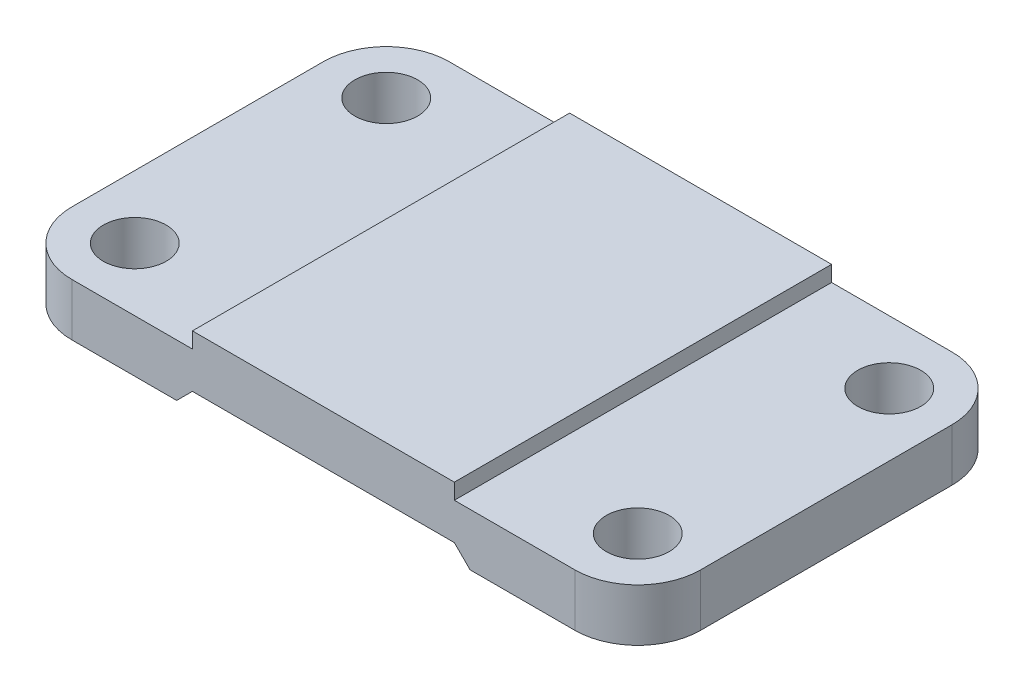
ISO-10303-21;
HEADER;
FILE_DESCRIPTION(('STEP AP214'),'2;1');
FILE_NAME('part.step','',(''),(''),'','','');
FILE_SCHEMA(('AUTOMOTIVE_DESIGN { 1 0 10303 214 1 1 1 1 }'));
ENDSEC;
DATA;
#1=APPLICATION_CONTEXT('core data for automotive mechanical design processes');
#2=APPLICATION_PROTOCOL_DEFINITION('international standard','automotive_design',2000,#1);
#3=PRODUCT_CONTEXT('',#1,'mechanical');
#4=PRODUCT('Part','Part','',(#3));
#5=PRODUCT_RELATED_PRODUCT_CATEGORY('part','',(#4));
#6=PRODUCT_DEFINITION_FORMATION('','',#4);
#7=PRODUCT_DEFINITION_CONTEXT('part definition',#1,'design');
#8=PRODUCT_DEFINITION('design','',#6,#7);
#9=PRODUCT_DEFINITION_SHAPE('','',#8);
#10=(LENGTH_UNIT() NAMED_UNIT(*) SI_UNIT(.MILLI.,.METRE.));
#11=(NAMED_UNIT(*) PLANE_ANGLE_UNIT() SI_UNIT($,.RADIAN.));
#12=(NAMED_UNIT(*) SI_UNIT($,.STERADIAN.) SOLID_ANGLE_UNIT());
#13=UNCERTAINTY_MEASURE_WITH_UNIT(LENGTH_MEASURE(1.E-05),#10,'distance_accuracy_value','');
#14=(GEOMETRIC_REPRESENTATION_CONTEXT(3) GLOBAL_UNCERTAINTY_ASSIGNED_CONTEXT((#13)) GLOBAL_UNIT_ASSIGNED_CONTEXT((#10,
#11,#12)) REPRESENTATION_CONTEXT('',''));
#15=CARTESIAN_POINT('',(0.,0.,0.));
#16=DIRECTION('',(0.,0.,1.));
#17=DIRECTION('',(1.,0.,0.));
#18=AXIS2_PLACEMENT_3D('',#15,#16,#17);
#19=CARTESIAN_POINT('',(-48.,0.,-24.));
#20=DIRECTION('',(0.,1.,0.));
#21=DIRECTION('',(0.,0.,1.));
#22=AXIS2_PLACEMENT_3D('',#19,#20,#21);
#23=PLANE('',#22);
#24=CARTESIAN_POINT('',(48.,0.,24.));
#25=DIRECTION('',(0.,1.,0.));
#26=DIRECTION('',(0.,0.,1.));
#27=AXIS2_PLACEMENT_3D('',#24,#25,#26);
#28=CIRCLE('',#27,5.99999999999999);
#29=CARTESIAN_POINT('',(48.,0.,30.));
#30=VERTEX_POINT('',#29);
#31=EDGE_CURVE('E214',#30,#30,#28,.T.);
#32=ORIENTED_EDGE('',*,*,#31,.T.);
#33=EDGE_LOOP('',(#32));
#34=FACE_BOUND('',#33,.T.);
#35=CARTESIAN_POINT('',(48.,0.,-24.));
#36=DIRECTION('',(0.,1.,0.));
#37=DIRECTION('',(0.,0.,1.));
#38=AXIS2_PLACEMENT_3D('',#35,#36,#37);
#39=CIRCLE('',#38,6.);
#40=CARTESIAN_POINT('',(48.,0.,-18.));
#41=VERTEX_POINT('',#40);
#42=EDGE_CURVE('E210',#41,#41,#39,.T.);
#43=ORIENTED_EDGE('',*,*,#42,.T.);
#44=EDGE_LOOP('',(#43));
#45=FACE_BOUND('',#44,.T.);
#46=DIRECTION('',(0.,0.,1.));
#47=VECTOR('',#46,1.);
#48=CARTESIAN_POINT('',(28.,0.,-36.));
#49=LINE('',#48,#47);
#50=CARTESIAN_POINT('',(28.,0.,-36.));
#51=VERTEX_POINT('',#50);
#52=CARTESIAN_POINT('',(28.,0.,36.));
#53=VERTEX_POINT('',#52);
#54=EDGE_CURVE('E179',#51,#53,#49,.T.);
#55=ORIENTED_EDGE('',*,*,#54,.F.);
#56=DIRECTION('',(-1.,0.,0.));
#57=VECTOR('',#56,1.);
#58=CARTESIAN_POINT('',(47.9999999999999,0.,-36.));
#59=LINE('',#58,#57);
#60=CARTESIAN_POINT('',(47.9999999999999,0.,-36.));
#61=VERTEX_POINT('',#60);
#62=EDGE_CURVE('E170',#61,#51,#59,.T.);
#63=ORIENTED_EDGE('',*,*,#62,.F.);
#64=CARTESIAN_POINT('',(48.,0.,-24.));
#65=DIRECTION('',(0.,1.,0.));
#66=DIRECTION('',(0.,0.,1.));
#67=AXIS2_PLACEMENT_3D('',#64,#65,#66);
#68=CIRCLE('',#67,12.);
#69=CARTESIAN_POINT('',(60.,0.,-23.9999999999999));
#70=VERTEX_POINT('',#69);
#71=EDGE_CURVE('E269',#70,#61,#68,.T.);
#72=ORIENTED_EDGE('',*,*,#71,.F.);
#73=DIRECTION('',(0.,0.,-1.));
#74=VECTOR('',#73,1.);
#75=CARTESIAN_POINT('',(60.,0.,23.9999999999999));
#76=LINE('',#75,#74);
#77=CARTESIAN_POINT('',(60.,0.,23.9999999999999));
#78=VERTEX_POINT('',#77);
#79=EDGE_CURVE('E267',#78,#70,#76,.T.);
#80=ORIENTED_EDGE('',*,*,#79,.F.);
#81=CARTESIAN_POINT('',(48.,0.,24.));
#82=DIRECTION('',(0.,1.,0.));
#83=DIRECTION('',(0.,0.,1.));
#84=AXIS2_PLACEMENT_3D('',#81,#82,#83);
#85=CIRCLE('',#84,12.);
#86=CARTESIAN_POINT('',(47.9999999999999,0.,36.));
#87=VERTEX_POINT('',#86);
#88=EDGE_CURVE('E265',#87,#78,#85,.T.);
#89=ORIENTED_EDGE('',*,*,#88,.F.);
#90=DIRECTION('',(1.,0.,0.));
#91=VECTOR('',#90,1.);
#92=CARTESIAN_POINT('',(47.9999999999999,0.,36.));
#93=LINE('',#92,#91);
#94=EDGE_CURVE('E261',#53,#87,#93,.T.);
#95=ORIENTED_EDGE('',*,*,#94,.F.);
#96=EDGE_LOOP('',(#55,#63,#72,#80,#89,#95));
#97=FACE_BOUND('',#96,.T.);
#98=ADVANCED_FACE('F36',(#34,#45,#97),#23,.F.);
#99=CARTESIAN_POINT('',(47.9999999999999,10.,36.));
#100=DIRECTION('',(0.,0.,-1.));
#101=DIRECTION('',(-1.,0.,0.));
#102=AXIS2_PLACEMENT_3D('',#99,#100,#101);
#103=PLANE('',#102);
#104=DIRECTION('',(0.707106781186553,-0.707106781186542,0.));
#105=VECTOR('',#104,1.);
#106=CARTESIAN_POINT('',(13.9999999999998,14.,36.));
#107=LINE('',#106,#105);
#108=CARTESIAN_POINT('',(25.,3.00000000000008,36.));
#109=VERTEX_POINT('',#108);
#110=EDGE_CURVE('E163',#109,#53,#107,.T.);
#111=ORIENTED_EDGE('',*,*,#110,.T.);
#112=ORIENTED_EDGE('',*,*,#94,.T.);
#113=DIRECTION('',(0.,-1.,0.));
#114=VECTOR('',#113,1.);
#115=CARTESIAN_POINT('',(47.9999999999999,10.,36.));
#116=LINE('',#115,#114);
#117=CARTESIAN_POINT('',(47.9999999999999,10.,36.));
#118=VERTEX_POINT('',#117);
#119=EDGE_CURVE('E283',#118,#87,#116,.T.);
#120=ORIENTED_EDGE('',*,*,#119,.F.);
#121=DIRECTION('',(1.,0.,0.));
#122=VECTOR('',#121,1.);
#123=CARTESIAN_POINT('',(47.9999999999999,10.,36.));
#124=LINE('',#123,#122);
#125=CARTESIAN_POINT('',(25.,10.,36.));
#126=VERTEX_POINT('',#125);
#127=EDGE_CURVE('E242',#126,#118,#124,.T.);
#128=ORIENTED_EDGE('',*,*,#127,.F.);
#129=DIRECTION('',(0.,-1.,0.));
#130=VECTOR('',#129,1.);
#131=CARTESIAN_POINT('',(25.,13.,36.));
#132=LINE('',#131,#130);
#133=CARTESIAN_POINT('',(25.,13.,36.));
#134=VERTEX_POINT('',#133);
#135=EDGE_CURVE('E195',#134,#126,#132,.T.);
#136=ORIENTED_EDGE('',*,*,#135,.F.);
#137=DIRECTION('',(1.,0.,0.));
#138=VECTOR('',#137,1.);
#139=CARTESIAN_POINT('',(-25.,13.,36.));
#140=LINE('',#139,#138);
#141=CARTESIAN_POINT('',(-25.,13.,36.));
#142=VERTEX_POINT('',#141);
#143=EDGE_CURVE('E193',#142,#134,#140,.T.);
#144=ORIENTED_EDGE('',*,*,#143,.F.);
#145=DIRECTION('',(0.,-1.,0.));
#146=VECTOR('',#145,1.);
#147=CARTESIAN_POINT('',(-25.,13.,36.));
#148=LINE('',#147,#146);
#149=CARTESIAN_POINT('',(-25.,10.,36.));
#150=VERTEX_POINT('',#149);
#151=EDGE_CURVE('E201',#142,#150,#148,.T.);
#152=ORIENTED_EDGE('',*,*,#151,.T.);
#153=CARTESIAN_POINT('',(-47.9999999999999,10.,36.));
#154=VERTEX_POINT('',#153);
#155=EDGE_CURVE('E243',#154,#150,#124,.T.);
#156=ORIENTED_EDGE('',*,*,#155,.F.);
#157=DIRECTION('',(0.,-1.,0.));
#158=VECTOR('',#157,1.);
#159=CARTESIAN_POINT('',(-47.9999999999999,10.,36.));
#160=LINE('',#159,#158);
#161=CARTESIAN_POINT('',(-47.9999999999999,0.,36.));
#162=VERTEX_POINT('',#161);
#163=EDGE_CURVE('E286',#154,#162,#160,.T.);
#164=ORIENTED_EDGE('',*,*,#163,.T.);
#165=CARTESIAN_POINT('',(-28.,0.,36.));
#166=VERTEX_POINT('',#165);
#167=EDGE_CURVE('E262',#162,#166,#93,.T.);
#168=ORIENTED_EDGE('',*,*,#167,.T.);
#169=DIRECTION('',(-0.707106781186551,-0.707106781186545,0.));
#170=VECTOR('',#169,1.);
#171=CARTESIAN_POINT('',(-13.9999999999999,14.,36.));
#172=LINE('',#171,#170);
#173=CARTESIAN_POINT('',(-25.,2.99999999999999,36.));
#174=VERTEX_POINT('',#173);
#175=EDGE_CURVE('E171',#174,#166,#172,.T.);
#176=ORIENTED_EDGE('',*,*,#175,.F.);
#177=DIRECTION('',(1.,0.,0.));
#178=VECTOR('',#177,1.);
#179=CARTESIAN_POINT('',(0.,3.00000000000003,36.));
#180=LINE('',#179,#178);
#181=EDGE_CURVE('E173',#174,#109,#180,.T.);
#182=ORIENTED_EDGE('',*,*,#181,.T.);
#183=EDGE_LOOP('',(#111,#112,#120,#128,#136,#144,#152,#156,#164,#168,#176,#182));
#184=FACE_BOUND('',#183,.T.);
#185=ADVANCED_FACE('F304',(#184),#103,.F.);
#186=CARTESIAN_POINT('',(47.9999999999999,10.,-36.));
#187=DIRECTION('',(0.,0.,1.));
#188=DIRECTION('',(1.,0.,0.));
#189=AXIS2_PLACEMENT_3D('',#186,#187,#188);
#190=PLANE('',#189);
#191=DIRECTION('',(0.707106781186553,-0.707106781186542,0.));
#192=VECTOR('',#191,1.);
#193=CARTESIAN_POINT('',(13.9999999999998,14.,-36.));
#194=LINE('',#193,#192);
#195=CARTESIAN_POINT('',(25.,3.00000000000008,-36.));
#196=VERTEX_POINT('',#195);
#197=EDGE_CURVE('E157',#196,#51,#194,.T.);
#198=ORIENTED_EDGE('',*,*,#197,.F.);
#199=DIRECTION('',(1.,0.,0.));
#200=VECTOR('',#199,1.);
#201=CARTESIAN_POINT('',(0.,3.00000000000003,-36.));
#202=LINE('',#201,#200);
#203=CARTESIAN_POINT('',(-25.,2.99999999999999,-36.));
#204=VERTEX_POINT('',#203);
#205=EDGE_CURVE('E148',#204,#196,#202,.T.);
#206=ORIENTED_EDGE('',*,*,#205,.F.);
#207=DIRECTION('',(-0.707106781186551,-0.707106781186545,0.));
#208=VECTOR('',#207,1.);
#209=CARTESIAN_POINT('',(-13.9999999999999,14.,-36.));
#210=LINE('',#209,#208);
#211=CARTESIAN_POINT('',(-28.,0.,-36.));
#212=VERTEX_POINT('',#211);
#213=EDGE_CURVE('E51',#204,#212,#210,.T.);
#214=ORIENTED_EDGE('',*,*,#213,.T.);
#215=CARTESIAN_POINT('',(-47.9999999999999,0.,-36.));
#216=VERTEX_POINT('',#215);
#217=EDGE_CURVE('E271',#212,#216,#59,.T.);
#218=ORIENTED_EDGE('',*,*,#217,.T.);
#219=DIRECTION('',(0.,-1.,0.));
#220=VECTOR('',#219,1.);
#221=CARTESIAN_POINT('',(-47.9999999999999,10.,-36.));
#222=LINE('',#221,#220);
#223=CARTESIAN_POINT('',(-47.9999999999999,10.,-36.));
#224=VERTEX_POINT('',#223);
#225=EDGE_CURVE('E254',#224,#216,#222,.T.);
#226=ORIENTED_EDGE('',*,*,#225,.F.);
#227=DIRECTION('',(-1.,0.,0.));
#228=VECTOR('',#227,1.);
#229=CARTESIAN_POINT('',(47.9999999999999,10.,-36.));
#230=LINE('',#229,#228);
#231=CARTESIAN_POINT('',(-25.,10.,-36.));
#232=VERTEX_POINT('',#231);
#233=EDGE_CURVE('E251',#232,#224,#230,.T.);
#234=ORIENTED_EDGE('',*,*,#233,.F.);
#235=DIRECTION('',(0.,-1.,0.));
#236=VECTOR('',#235,1.);
#237=CARTESIAN_POINT('',(-25.,13.,-36.));
#238=LINE('',#237,#236);
#239=CARTESIAN_POINT('',(-25.,13.,-36.));
#240=VERTEX_POINT('',#239);
#241=EDGE_CURVE('E204',#240,#232,#238,.T.);
#242=ORIENTED_EDGE('',*,*,#241,.F.);
#243=DIRECTION('',(-1.,0.,0.));
#244=VECTOR('',#243,1.);
#245=CARTESIAN_POINT('',(-25.,13.,-36.));
#246=LINE('',#245,#244);
#247=CARTESIAN_POINT('',(25.,13.,-36.));
#248=VERTEX_POINT('',#247);
#249=EDGE_CURVE('E189',#248,#240,#246,.T.);
#250=ORIENTED_EDGE('',*,*,#249,.F.);
#251=DIRECTION('',(0.,-1.,0.));
#252=VECTOR('',#251,1.);
#253=CARTESIAN_POINT('',(25.,13.,-36.));
#254=LINE('',#253,#252);
#255=CARTESIAN_POINT('',(25.,10.,-36.));
#256=VERTEX_POINT('',#255);
#257=EDGE_CURVE('E207',#248,#256,#254,.T.);
#258=ORIENTED_EDGE('',*,*,#257,.T.);
#259=CARTESIAN_POINT('',(47.9999999999999,10.,-36.));
#260=VERTEX_POINT('',#259);
#261=EDGE_CURVE('E252',#260,#256,#230,.T.);
#262=ORIENTED_EDGE('',*,*,#261,.F.);
#263=DIRECTION('',(0.,-1.,0.));
#264=VECTOR('',#263,1.);
#265=CARTESIAN_POINT('',(47.9999999999999,10.,-36.));
#266=LINE('',#265,#264);
#267=EDGE_CURVE('E275',#260,#61,#266,.T.);
#268=ORIENTED_EDGE('',*,*,#267,.T.);
#269=ORIENTED_EDGE('',*,*,#62,.T.);
#270=EDGE_LOOP('',(#198,#206,#214,#218,#226,#234,#242,#250,#258,#262,#268,#269));
#271=FACE_BOUND('',#270,.T.);
#272=ADVANCED_FACE('F167',(#271),#190,.F.);
#273=CARTESIAN_POINT('',(-48.,10.,-24.));
#274=DIRECTION('',(0.,1.,0.));
#275=DIRECTION('',(0.,0.,1.));
#276=AXIS2_PLACEMENT_3D('',#273,#274,#275);
#277=PLANE('',#276);
#278=DIRECTION('',(0.,0.,-1.));
#279=VECTOR('',#278,1.);
#280=CARTESIAN_POINT('',(25.,10.,-36.));
#281=LINE('',#280,#279);
#282=EDGE_CURVE('E181',#126,#256,#281,.T.);
#283=ORIENTED_EDGE('',*,*,#282,.F.);
#284=ORIENTED_EDGE('',*,*,#127,.T.);
#285=CARTESIAN_POINT('',(48.,10.,24.));
#286=DIRECTION('',(0.,1.,0.));
#287=DIRECTION('',(0.,0.,1.));
#288=AXIS2_PLACEMENT_3D('',#285,#286,#287);
#289=CIRCLE('',#288,12.);
#290=CARTESIAN_POINT('',(60.,10.,23.9999999999999));
#291=VERTEX_POINT('',#290);
#292=EDGE_CURVE('E245',#118,#291,#289,.T.);
#293=ORIENTED_EDGE('',*,*,#292,.T.);
#294=DIRECTION('',(0.,0.,-1.));
#295=VECTOR('',#294,1.);
#296=CARTESIAN_POINT('',(60.,10.,23.9999999999999));
#297=LINE('',#296,#295);
#298=CARTESIAN_POINT('',(60.,10.,-23.9999999999999));
#299=VERTEX_POINT('',#298);
#300=EDGE_CURVE('E247',#291,#299,#297,.T.);
#301=ORIENTED_EDGE('',*,*,#300,.T.);
#302=CARTESIAN_POINT('',(48.,10.,-24.));
#303=DIRECTION('',(0.,1.,0.));
#304=DIRECTION('',(0.,0.,1.));
#305=AXIS2_PLACEMENT_3D('',#302,#303,#304);
#306=CIRCLE('',#305,12.);
#307=EDGE_CURVE('E249',#299,#260,#306,.T.);
#308=ORIENTED_EDGE('',*,*,#307,.T.);
#309=ORIENTED_EDGE('',*,*,#261,.T.);
#310=EDGE_LOOP('',(#283,#284,#293,#301,#308,#309));
#311=FACE_BOUND('',#310,.T.);
#312=CARTESIAN_POINT('',(48.,10.,-24.));
#313=DIRECTION('',(0.,1.,0.));
#314=DIRECTION('',(0.,0.,1.));
#315=AXIS2_PLACEMENT_3D('',#312,#313,#314);
#316=CIRCLE('',#315,6.);
#317=CARTESIAN_POINT('',(48.,10.,-18.));
#318=VERTEX_POINT('',#317);
#319=EDGE_CURVE('E211',#318,#318,#316,.T.);
#320=ORIENTED_EDGE('',*,*,#319,.F.);
#321=EDGE_LOOP('',(#320));
#322=FACE_BOUND('',#321,.T.);
#323=CARTESIAN_POINT('',(48.,10.,24.));
#324=DIRECTION('',(0.,1.,0.));
#325=DIRECTION('',(0.,0.,1.));
#326=AXIS2_PLACEMENT_3D('',#323,#324,#325);
#327=CIRCLE('',#326,5.99999999999999);
#328=CARTESIAN_POINT('',(48.,10.,30.));
#329=VERTEX_POINT('',#328);
#330=EDGE_CURVE('E217',#329,#329,#327,.T.);
#331=ORIENTED_EDGE('',*,*,#330,.F.);
#332=EDGE_LOOP('',(#331));
#333=FACE_BOUND('',#332,.T.);
#334=ADVANCED_FACE('F340',(#311,#322,#333),#277,.T.);
#335=DIRECTION('',(0.,0.,1.));
#336=VECTOR('',#335,1.);
#337=CARTESIAN_POINT('',(-25.,10.,-36.));
#338=LINE('',#337,#336);
#339=EDGE_CURVE('E59',#232,#150,#338,.T.);
#340=ORIENTED_EDGE('',*,*,#339,.F.);
#341=ORIENTED_EDGE('',*,*,#233,.T.);
#342=CARTESIAN_POINT('',(-48.,10.,-24.));
#343=DIRECTION('',(0.,1.,0.));
#344=DIRECTION('',(0.,0.,1.));
#345=AXIS2_PLACEMENT_3D('',#342,#343,#344);
#346=CIRCLE('',#345,12.);
#347=CARTESIAN_POINT('',(-60.,10.,-23.9999999999999));
#348=VERTEX_POINT('',#347);
#349=EDGE_CURVE('E235',#224,#348,#346,.T.);
#350=ORIENTED_EDGE('',*,*,#349,.T.);
#351=DIRECTION('',(0.,0.,1.));
#352=VECTOR('',#351,1.);
#353=CARTESIAN_POINT('',(-60.,10.,23.9999999999999));
#354=LINE('',#353,#352);
#355=CARTESIAN_POINT('',(-60.,10.,23.9999999999999));
#356=VERTEX_POINT('',#355);
#357=EDGE_CURVE('E238',#348,#356,#354,.T.);
#358=ORIENTED_EDGE('',*,*,#357,.T.);
#359=CARTESIAN_POINT('',(-48.,10.,24.));
#360=DIRECTION('',(0.,1.,0.));
#361=DIRECTION('',(0.,0.,-1.));
#362=AXIS2_PLACEMENT_3D('',#359,#360,#361);
#363=CIRCLE('',#362,12.);
#364=EDGE_CURVE('E240',#356,#154,#363,.T.);
#365=ORIENTED_EDGE('',*,*,#364,.T.);
#366=ORIENTED_EDGE('',*,*,#155,.T.);
#367=EDGE_LOOP('',(#340,#341,#350,#358,#365,#366));
#368=FACE_BOUND('',#367,.T.);
#369=CARTESIAN_POINT('',(-48.,10.,-24.));
#370=DIRECTION('',(0.,1.,0.));
#371=DIRECTION('',(0.,0.,1.));
#372=AXIS2_PLACEMENT_3D('',#369,#370,#371);
#373=CIRCLE('',#372,6.);
#374=CARTESIAN_POINT('',(-48.,10.,-18.));
#375=VERTEX_POINT('',#374);
#376=EDGE_CURVE('E229',#375,#375,#373,.T.);
#377=ORIENTED_EDGE('',*,*,#376,.F.);
#378=EDGE_LOOP('',(#377));
#379=FACE_BOUND('',#378,.T.);
#380=CARTESIAN_POINT('',(-48.,10.,24.));
#381=DIRECTION('',(0.,1.,0.));
#382=DIRECTION('',(0.,0.,1.));
#383=AXIS2_PLACEMENT_3D('',#380,#381,#382);
#384=CIRCLE('',#383,5.99999999999999);
#385=CARTESIAN_POINT('',(-48.,10.,30.));
#386=VERTEX_POINT('',#385);
#387=EDGE_CURVE('E223',#386,#386,#384,.T.);
#388=ORIENTED_EDGE('',*,*,#387,.F.);
#389=EDGE_LOOP('',(#388));
#390=FACE_BOUND('',#389,.T.);
#391=ADVANCED_FACE('F308',(#368,#379,#390),#277,.T.);
#392=ORIENTED_EDGE('',*,*,#217,.F.);
#393=DIRECTION('',(0.,0.,1.));
#394=VECTOR('',#393,1.);
#395=CARTESIAN_POINT('',(-28.,0.,-36.));
#396=LINE('',#395,#394);
#397=EDGE_CURVE('E182',#212,#166,#396,.T.);
#398=ORIENTED_EDGE('',*,*,#397,.T.);
#399=ORIENTED_EDGE('',*,*,#167,.F.);
#400=CARTESIAN_POINT('',(-48.,0.,24.));
#401=DIRECTION('',(0.,1.,0.));
#402=DIRECTION('',(0.,0.,-1.));
#403=AXIS2_PLACEMENT_3D('',#400,#401,#402);
#404=CIRCLE('',#403,12.);
#405=CARTESIAN_POINT('',(-60.,0.,23.9999999999999));
#406=VERTEX_POINT('',#405);
#407=EDGE_CURVE('E259',#406,#162,#404,.T.);
#408=ORIENTED_EDGE('',*,*,#407,.F.);
#409=DIRECTION('',(0.,0.,1.));
#410=VECTOR('',#409,1.);
#411=CARTESIAN_POINT('',(-60.,0.,23.9999999999999));
#412=LINE('',#411,#410);
#413=CARTESIAN_POINT('',(-60.,0.,-23.9999999999999));
#414=VERTEX_POINT('',#413);
#415=EDGE_CURVE('E257',#414,#406,#412,.T.);
#416=ORIENTED_EDGE('',*,*,#415,.F.);
#417=CARTESIAN_POINT('',(-48.,0.,-24.));
#418=DIRECTION('',(0.,1.,0.));
#419=DIRECTION('',(0.,0.,1.));
#420=AXIS2_PLACEMENT_3D('',#417,#418,#419);
#421=CIRCLE('',#420,12.);
#422=EDGE_CURVE('E232',#216,#414,#421,.T.);
#423=ORIENTED_EDGE('',*,*,#422,.F.);
#424=EDGE_LOOP('',(#392,#398,#399,#408,#416,#423));
#425=FACE_BOUND('',#424,.T.);
#426=CARTESIAN_POINT('',(-48.,0.,-24.));
#427=DIRECTION('',(0.,1.,0.));
#428=DIRECTION('',(0.,0.,1.));
#429=AXIS2_PLACEMENT_3D('',#426,#427,#428);
#430=CIRCLE('',#429,6.);
#431=CARTESIAN_POINT('',(-48.,0.,-18.));
#432=VERTEX_POINT('',#431);
#433=EDGE_CURVE('E226',#432,#432,#430,.T.);
#434=ORIENTED_EDGE('',*,*,#433,.T.);
#435=EDGE_LOOP('',(#434));
#436=FACE_BOUND('',#435,.T.);
#437=CARTESIAN_POINT('',(-48.,0.,24.));
#438=DIRECTION('',(0.,1.,0.));
#439=DIRECTION('',(0.,0.,1.));
#440=AXIS2_PLACEMENT_3D('',#437,#438,#439);
#441=CIRCLE('',#440,5.99999999999999);
#442=CARTESIAN_POINT('',(-48.,0.,30.));
#443=VERTEX_POINT('',#442);
#444=EDGE_CURVE('E220',#443,#443,#441,.T.);
#445=ORIENTED_EDGE('',*,*,#444,.T.);
#446=EDGE_LOOP('',(#445));
#447=FACE_BOUND('',#446,.T.);
#448=ADVANCED_FACE('F299',(#425,#436,#447),#23,.F.);
#449=CARTESIAN_POINT('',(-48.,10.,-24.));
#450=DIRECTION('',(0.,-1.,0.));
#451=DIRECTION('',(0.,0.,-1.));
#452=AXIS2_PLACEMENT_3D('',#449,#450,#451);
#453=CYLINDRICAL_SURFACE('',#452,12.);
#454=ORIENTED_EDGE('',*,*,#422,.T.);
#455=DIRECTION('',(0.,-1.,0.));
#456=VECTOR('',#455,1.);
#457=CARTESIAN_POINT('',(-60.,10.,-23.9999999999999));
#458=LINE('',#457,#456);
#459=EDGE_CURVE('E11',#348,#414,#458,.T.);
#460=ORIENTED_EDGE('',*,*,#459,.F.);
#461=ORIENTED_EDGE('',*,*,#349,.F.);
#462=ORIENTED_EDGE('',*,*,#225,.T.);
#463=EDGE_LOOP('',(#454,#460,#461,#462));
#464=FACE_BOUND('',#463,.T.);
#465=ADVANCED_FACE('F38',(#464),#453,.T.);
#466=CARTESIAN_POINT('',(-60.,10.,23.9999999999999));
#467=DIRECTION('',(1.,0.,0.));
#468=DIRECTION('',(0.,0.,-1.));
#469=AXIS2_PLACEMENT_3D('',#466,#467,#468);
#470=PLANE('',#469);
#471=ORIENTED_EDGE('',*,*,#415,.T.);
#472=DIRECTION('',(0.,-1.,0.));
#473=VECTOR('',#472,1.);
#474=CARTESIAN_POINT('',(-60.,10.,23.9999999999999));
#475=LINE('',#474,#473);
#476=EDGE_CURVE('E44',#356,#406,#475,.T.);
#477=ORIENTED_EDGE('',*,*,#476,.F.);
#478=ORIENTED_EDGE('',*,*,#357,.F.);
#479=ORIENTED_EDGE('',*,*,#459,.T.);
#480=EDGE_LOOP('',(#471,#477,#478,#479));
#481=FACE_BOUND('',#480,.T.);
#482=ADVANCED_FACE('F318',(#481),#470,.F.);
#483=CARTESIAN_POINT('',(-48.,10.,24.));
#484=DIRECTION('',(0.,-1.,0.));
#485=DIRECTION('',(0.,0.,-1.));
#486=AXIS2_PLACEMENT_3D('',#483,#484,#485);
#487=CYLINDRICAL_SURFACE('',#486,12.);
#488=ORIENTED_EDGE('',*,*,#407,.T.);
#489=ORIENTED_EDGE('',*,*,#163,.F.);
#490=ORIENTED_EDGE('',*,*,#364,.F.);
#491=ORIENTED_EDGE('',*,*,#476,.T.);
#492=EDGE_LOOP('',(#488,#489,#490,#491));
#493=FACE_BOUND('',#492,.T.);
#494=ADVANCED_FACE('F293',(#493),#487,.T.);
#495=CARTESIAN_POINT('',(48.,10.,24.));
#496=DIRECTION('',(0.,-1.,0.));
#497=DIRECTION('',(0.,0.,-1.));
#498=AXIS2_PLACEMENT_3D('',#495,#496,#497);
#499=CYLINDRICAL_SURFACE('',#498,12.);
#500=ORIENTED_EDGE('',*,*,#88,.T.);
#501=DIRECTION('',(0.,-1.,0.));
#502=VECTOR('',#501,1.);
#503=CARTESIAN_POINT('',(60.,10.,23.9999999999999));
#504=LINE('',#503,#502);
#505=EDGE_CURVE('E280',#291,#78,#504,.T.);
#506=ORIENTED_EDGE('',*,*,#505,.F.);
#507=ORIENTED_EDGE('',*,*,#292,.F.);
#508=ORIENTED_EDGE('',*,*,#119,.T.);
#509=EDGE_LOOP('',(#500,#506,#507,#508));
#510=FACE_BOUND('',#509,.T.);
#511=ADVANCED_FACE('F324',(#510),#499,.T.);
#512=CARTESIAN_POINT('',(60.,10.,23.9999999999999));
#513=DIRECTION('',(-1.,0.,0.));
#514=DIRECTION('',(0.,0.,1.));
#515=AXIS2_PLACEMENT_3D('',#512,#513,#514);
#516=PLANE('',#515);
#517=ORIENTED_EDGE('',*,*,#79,.T.);
#518=DIRECTION('',(0.,-1.,0.));
#519=VECTOR('',#518,1.);
#520=CARTESIAN_POINT('',(60.,10.,-23.9999999999999));
#521=LINE('',#520,#519);
#522=EDGE_CURVE('E277',#299,#70,#521,.T.);
#523=ORIENTED_EDGE('',*,*,#522,.F.);
#524=ORIENTED_EDGE('',*,*,#300,.F.);
#525=ORIENTED_EDGE('',*,*,#505,.T.);
#526=EDGE_LOOP('',(#517,#523,#524,#525));
#527=FACE_BOUND('',#526,.T.);
#528=ADVANCED_FACE('F392',(#527),#516,.F.);
#529=CARTESIAN_POINT('',(48.,10.,-24.));
#530=DIRECTION('',(0.,-1.,0.));
#531=DIRECTION('',(0.,0.,-1.));
#532=AXIS2_PLACEMENT_3D('',#529,#530,#531);
#533=CYLINDRICAL_SURFACE('',#532,12.);
#534=ORIENTED_EDGE('',*,*,#71,.T.);
#535=ORIENTED_EDGE('',*,*,#267,.F.);
#536=ORIENTED_EDGE('',*,*,#307,.F.);
#537=ORIENTED_EDGE('',*,*,#522,.T.);
#538=EDGE_LOOP('',(#534,#535,#536,#537));
#539=FACE_BOUND('',#538,.T.);
#540=ADVANCED_FACE('F350',(#539),#533,.T.);
#541=CARTESIAN_POINT('',(-48.,10.,-24.));
#542=DIRECTION('',(0.,-1.,0.));
#543=DIRECTION('',(0.,0.,-1.));
#544=AXIS2_PLACEMENT_3D('',#541,#542,#543);
#545=CYLINDRICAL_SURFACE('',#544,6.);
#546=ORIENTED_EDGE('',*,*,#376,.T.);
#547=EDGE_LOOP('',(#546));
#548=FACE_BOUND('',#547,.T.);
#549=ORIENTED_EDGE('',*,*,#433,.F.);
#550=EDGE_LOOP('',(#549));
#551=FACE_BOUND('',#550,.T.);
#552=ADVANCED_FACE('F346',(#548,#551),#545,.F.);
#553=CARTESIAN_POINT('',(-48.,10.,24.));
#554=DIRECTION('',(0.,-1.,0.));
#555=DIRECTION('',(0.,0.,-1.));
#556=AXIS2_PLACEMENT_3D('',#553,#554,#555);
#557=CYLINDRICAL_SURFACE('',#556,5.99999999999999);
#558=ORIENTED_EDGE('',*,*,#387,.T.);
#559=EDGE_LOOP('',(#558));
#560=FACE_BOUND('',#559,.T.);
#561=ORIENTED_EDGE('',*,*,#444,.F.);
#562=EDGE_LOOP('',(#561));
#563=FACE_BOUND('',#562,.T.);
#564=ADVANCED_FACE('F349',(#560,#563),#557,.F.);
#565=CARTESIAN_POINT('',(48.,10.,24.));
#566=DIRECTION('',(0.,-1.,0.));
#567=DIRECTION('',(0.,0.,-1.));
#568=AXIS2_PLACEMENT_3D('',#565,#566,#567);
#569=CYLINDRICAL_SURFACE('',#568,5.99999999999999);
#570=ORIENTED_EDGE('',*,*,#330,.T.);
#571=EDGE_LOOP('',(#570));
#572=FACE_BOUND('',#571,.T.);
#573=ORIENTED_EDGE('',*,*,#31,.F.);
#574=EDGE_LOOP('',(#573));
#575=FACE_BOUND('',#574,.T.);
#576=ADVANCED_FACE('F354',(#572,#575),#569,.F.);
#577=CARTESIAN_POINT('',(48.,10.,-24.));
#578=DIRECTION('',(0.,-1.,0.));
#579=DIRECTION('',(0.,0.,-1.));
#580=AXIS2_PLACEMENT_3D('',#577,#578,#579);
#581=CYLINDRICAL_SURFACE('',#580,6.);
#582=ORIENTED_EDGE('',*,*,#319,.T.);
#583=EDGE_LOOP('',(#582));
#584=FACE_BOUND('',#583,.T.);
#585=ORIENTED_EDGE('',*,*,#42,.F.);
#586=EDGE_LOOP('',(#585));
#587=FACE_BOUND('',#586,.T.);
#588=ADVANCED_FACE('F358',(#584,#587),#581,.F.);
#589=CARTESIAN_POINT('',(25.,13.,-36.));
#590=DIRECTION('',(-1.,0.,0.));
#591=DIRECTION('',(0.,0.,1.));
#592=AXIS2_PLACEMENT_3D('',#589,#590,#591);
#593=PLANE('',#592);
#594=ORIENTED_EDGE('',*,*,#282,.T.);
#595=ORIENTED_EDGE('',*,*,#257,.F.);
#596=DIRECTION('',(0.,0.,-1.));
#597=VECTOR('',#596,1.);
#598=CARTESIAN_POINT('',(25.,13.,-36.));
#599=LINE('',#598,#597);
#600=EDGE_CURVE('E186',#134,#248,#599,.T.);
#601=ORIENTED_EDGE('',*,*,#600,.F.);
#602=ORIENTED_EDGE('',*,*,#135,.T.);
#603=EDGE_LOOP('',(#594,#595,#601,#602));
#604=FACE_BOUND('',#603,.T.);
#605=ADVANCED_FACE('F362',(#604),#593,.F.);
#606=CARTESIAN_POINT('',(-25.,13.,-36.));
#607=DIRECTION('',(1.,0.,0.));
#608=DIRECTION('',(0.,0.,-1.));
#609=AXIS2_PLACEMENT_3D('',#606,#607,#608);
#610=PLANE('',#609);
#611=ORIENTED_EDGE('',*,*,#339,.T.);
#612=ORIENTED_EDGE('',*,*,#151,.F.);
#613=DIRECTION('',(0.,0.,1.));
#614=VECTOR('',#613,1.);
#615=CARTESIAN_POINT('',(-25.,13.,-36.));
#616=LINE('',#615,#614);
#617=EDGE_CURVE('E191',#240,#142,#616,.T.);
#618=ORIENTED_EDGE('',*,*,#617,.F.);
#619=ORIENTED_EDGE('',*,*,#241,.T.);
#620=EDGE_LOOP('',(#611,#612,#618,#619));
#621=FACE_BOUND('',#620,.T.);
#622=ADVANCED_FACE('F311',(#621),#610,.F.);
#623=CARTESIAN_POINT('',(0.,13.,0.));
#624=DIRECTION('',(0.,1.,0.));
#625=DIRECTION('',(0.,0.,1.));
#626=AXIS2_PLACEMENT_3D('',#623,#624,#625);
#627=PLANE('',#626);
#628=ORIENTED_EDGE('',*,*,#600,.T.);
#629=ORIENTED_EDGE('',*,*,#249,.T.);
#630=ORIENTED_EDGE('',*,*,#617,.T.);
#631=ORIENTED_EDGE('',*,*,#143,.T.);
#632=EDGE_LOOP('',(#628,#629,#630,#631));
#633=FACE_BOUND('',#632,.T.);
#634=ADVANCED_FACE('F369',(#633),#627,.T.);
#635=CARTESIAN_POINT('',(13.9999999999998,14.,-36.));
#636=DIRECTION('',(-0.707106781186542,-0.707106781186553,0.));
#637=DIRECTION('',(0.707106781186553,-0.707106781186542,0.));
#638=AXIS2_PLACEMENT_3D('',#635,#636,#637);
#639=PLANE('',#638);
#640=ORIENTED_EDGE('',*,*,#110,.F.);
#641=DIRECTION('',(0.,0.,1.));
#642=VECTOR('',#641,1.);
#643=CARTESIAN_POINT('',(25.,3.00000000000008,-36.));
#644=LINE('',#643,#642);
#645=EDGE_CURVE('E152',#196,#109,#644,.T.);
#646=ORIENTED_EDGE('',*,*,#645,.F.);
#647=ORIENTED_EDGE('',*,*,#197,.T.);
#648=ORIENTED_EDGE('',*,*,#54,.T.);
#649=EDGE_LOOP('',(#640,#646,#647,#648));
#650=FACE_BOUND('',#649,.T.);
#651=ADVANCED_FACE('F160',(#650),#639,.T.);
#652=CARTESIAN_POINT('',(-13.9999999999999,14.,-36.));
#653=DIRECTION('',(-0.707106781186545,0.707106781186551,0.));
#654=DIRECTION('',(-0.707106781186551,-0.707106781186545,0.));
#655=AXIS2_PLACEMENT_3D('',#652,#653,#654);
#656=PLANE('',#655);
#657=ORIENTED_EDGE('',*,*,#175,.T.);
#658=ORIENTED_EDGE('',*,*,#397,.F.);
#659=ORIENTED_EDGE('',*,*,#213,.F.);
#660=DIRECTION('',(0.,0.,1.));
#661=VECTOR('',#660,1.);
#662=CARTESIAN_POINT('',(-25.,2.99999999999999,-36.));
#663=LINE('',#662,#661);
#664=EDGE_CURVE('E154',#204,#174,#663,.T.);
#665=ORIENTED_EDGE('',*,*,#664,.T.);
#666=EDGE_LOOP('',(#657,#658,#659,#665));
#667=FACE_BOUND('',#666,.T.);
#668=ADVANCED_FACE('F375',(#667),#656,.F.);
#669=CARTESIAN_POINT('',(0.,3.00000000000003,-36.));
#670=DIRECTION('',(0.,-1.,0.));
#671=DIRECTION('',(1.,0.,0.));
#672=AXIS2_PLACEMENT_3D('',#669,#670,#671);
#673=PLANE('',#672);
#674=ORIENTED_EDGE('',*,*,#181,.F.);
#675=ORIENTED_EDGE('',*,*,#664,.F.);
#676=ORIENTED_EDGE('',*,*,#205,.T.);
#677=ORIENTED_EDGE('',*,*,#645,.T.);
#678=EDGE_LOOP('',(#674,#675,#676,#677));
#679=FACE_BOUND('',#678,.T.);
#680=ADVANCED_FACE('F151',(#679),#673,.T.);
#681=CLOSED_SHELL('',(#98,#185,#272,#334,#391,#448,#465,#482,#494,#511,#528,#540,#552,#564,#576,
#588,#605,#622,#634,#651,#668,#680));
#682=MANIFOLD_SOLID_BREP('B2',#681);
#683=ADVANCED_BREP_SHAPE_REPRESENTATION('',(#18,#682),#14);
#684=SHAPE_DEFINITION_REPRESENTATION(#9,#683);
ENDSEC;
END-ISO-10303-21;
